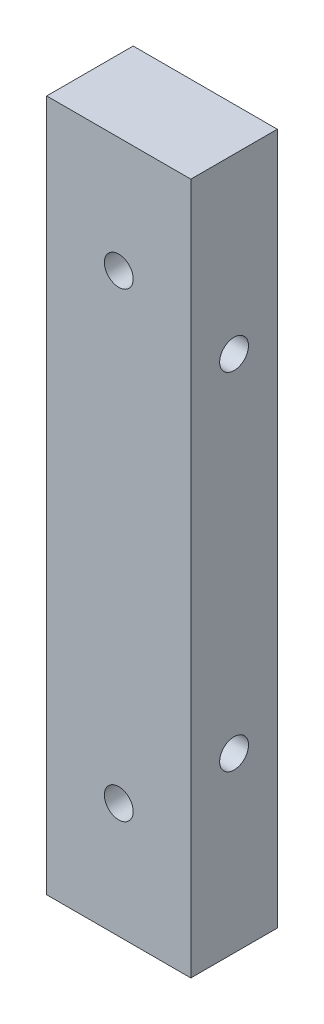
ISO-10303-21;
HEADER;
FILE_DESCRIPTION(('STEP AP214'),'2;1');
FILE_NAME('part.step','',(''),(''),'','','');
FILE_SCHEMA(('AUTOMOTIVE_DESIGN { 1 0 10303 214 1 1 1 1 }'));
ENDSEC;
DATA;
#1=APPLICATION_CONTEXT('core data for automotive mechanical design processes');
#2=APPLICATION_PROTOCOL_DEFINITION('international standard','automotive_design',2000,#1);
#3=PRODUCT_CONTEXT('',#1,'mechanical');
#4=PRODUCT('Part','Part','',(#3));
#5=PRODUCT_RELATED_PRODUCT_CATEGORY('part','',(#4));
#6=PRODUCT_DEFINITION_FORMATION('','',#4);
#7=PRODUCT_DEFINITION_CONTEXT('part definition',#1,'design');
#8=PRODUCT_DEFINITION('design','',#6,#7);
#9=PRODUCT_DEFINITION_SHAPE('','',#8);
#10=(LENGTH_UNIT() NAMED_UNIT(*) SI_UNIT(.MILLI.,.METRE.));
#11=(NAMED_UNIT(*) PLANE_ANGLE_UNIT() SI_UNIT($,.RADIAN.));
#12=(NAMED_UNIT(*) SI_UNIT($,.STERADIAN.) SOLID_ANGLE_UNIT());
#13=UNCERTAINTY_MEASURE_WITH_UNIT(LENGTH_MEASURE(1.E-05),#10,'distance_accuracy_value','');
#14=(GEOMETRIC_REPRESENTATION_CONTEXT(3) GLOBAL_UNCERTAINTY_ASSIGNED_CONTEXT((#13)) GLOBAL_UNIT_ASSIGNED_CONTEXT((#10,
#11,#12)) REPRESENTATION_CONTEXT('',''));
#15=CARTESIAN_POINT('',(0.,0.,0.));
#16=DIRECTION('',(0.,0.,1.));
#17=DIRECTION('',(1.,0.,0.));
#18=AXIS2_PLACEMENT_3D('',#15,#16,#17);
#19=CARTESIAN_POINT('',(12.5,60.,7.5));
#20=DIRECTION('',(-1.,0.,0.));
#21=DIRECTION('',(0.,0.,1.));
#22=AXIS2_PLACEMENT_3D('',#19,#20,#21);
#23=PLANE('',#22);
#24=CARTESIAN_POINT('',(12.5,30.,0.));
#25=DIRECTION('',(-1.,0.,0.));
#26=DIRECTION('',(0.,0.,1.));
#27=AXIS2_PLACEMENT_3D('',#24,#25,#26);
#28=CIRCLE('',#27,2.5);
#29=CARTESIAN_POINT('',(12.5,30.,2.49999999999998));
#30=VERTEX_POINT('',#29);
#31=EDGE_CURVE('E126',#30,#30,#28,.T.);
#32=ORIENTED_EDGE('',*,*,#31,.T.);
#33=EDGE_LOOP('',(#32));
#34=FACE_BOUND('',#33,.T.);
#35=CARTESIAN_POINT('',(12.5,-30.,0.));
#36=DIRECTION('',(-1.,0.,0.));
#37=DIRECTION('',(0.,0.,1.));
#38=AXIS2_PLACEMENT_3D('',#35,#36,#37);
#39=CIRCLE('',#38,2.5);
#40=CARTESIAN_POINT('',(12.5,-30.,2.5));
#41=VERTEX_POINT('',#40);
#42=EDGE_CURVE('E110',#41,#41,#39,.T.);
#43=ORIENTED_EDGE('',*,*,#42,.T.);
#44=EDGE_LOOP('',(#43));
#45=FACE_BOUND('',#44,.T.);
#46=DIRECTION('',(0.,0.,-1.));
#47=VECTOR('',#46,1.);
#48=CARTESIAN_POINT('',(12.5,-60.,7.5));
#49=LINE('',#48,#47);
#50=CARTESIAN_POINT('',(12.5,-60.,7.5));
#51=VERTEX_POINT('',#50);
#52=CARTESIAN_POINT('',(12.5,-60.,-7.5));
#53=VERTEX_POINT('',#52);
#54=EDGE_CURVE('E107',#51,#53,#49,.T.);
#55=ORIENTED_EDGE('',*,*,#54,.T.);
#56=DIRECTION('',(0.,-1.,0.));
#57=VECTOR('',#56,1.);
#58=CARTESIAN_POINT('',(12.5,60.,-7.5));
#59=LINE('',#58,#57);
#60=CARTESIAN_POINT('',(12.5,60.,-7.5));
#61=VERTEX_POINT('',#60);
#62=EDGE_CURVE('E11',#61,#53,#59,.T.);
#63=ORIENTED_EDGE('',*,*,#62,.F.);
#64=DIRECTION('',(0.,0.,-1.));
#65=VECTOR('',#64,1.);
#66=CARTESIAN_POINT('',(12.5,60.,7.5));
#67=LINE('',#66,#65);
#68=CARTESIAN_POINT('',(12.5,60.,7.5));
#69=VERTEX_POINT('',#68);
#70=EDGE_CURVE('E95',#69,#61,#67,.T.);
#71=ORIENTED_EDGE('',*,*,#70,.F.);
#72=DIRECTION('',(0.,-1.,0.));
#73=VECTOR('',#72,1.);
#74=CARTESIAN_POINT('',(12.5,60.,7.5));
#75=LINE('',#74,#73);
#76=EDGE_CURVE('E103',#69,#51,#75,.T.);
#77=ORIENTED_EDGE('',*,*,#76,.T.);
#78=EDGE_LOOP('',(#55,#63,#71,#77));
#79=FACE_BOUND('',#78,.T.);
#80=ADVANCED_FACE('F44',(#34,#45,#79),#23,.F.);
#81=CARTESIAN_POINT('',(-12.5,60.,-7.5));
#82=DIRECTION('',(0.,0.,1.));
#83=DIRECTION('',(1.,0.,0.));
#84=AXIS2_PLACEMENT_3D('',#81,#82,#83);
#85=PLANE('',#84);
#86=CARTESIAN_POINT('',(-7.49400541621981E-13,39.9999999999999,-7.5));
#87=DIRECTION('',(0.,0.,1.));
#88=DIRECTION('',(1.,0.,0.));
#89=AXIS2_PLACEMENT_3D('',#86,#87,#88);
#90=CIRCLE('',#89,2.5);
#91=CARTESIAN_POINT('',(2.49999999999925,39.9999999999999,-7.5));
#92=VERTEX_POINT('',#91);
#93=EDGE_CURVE('E138',#92,#92,#90,.T.);
#94=ORIENTED_EDGE('',*,*,#93,.T.);
#95=EDGE_LOOP('',(#94));
#96=FACE_BOUND('',#95,.T.);
#97=CARTESIAN_POINT('',(-7.7715611723761E-13,-40.0000000000001,-7.5));
#98=DIRECTION('',(0.,0.,1.));
#99=DIRECTION('',(1.,0.,0.));
#100=AXIS2_PLACEMENT_3D('',#97,#98,#99);
#101=CIRCLE('',#100,2.5);
#102=CARTESIAN_POINT('',(2.49999999999922,-40.0000000000001,-7.5));
#103=VERTEX_POINT('',#102);
#104=EDGE_CURVE('E132',#103,#103,#101,.T.);
#105=ORIENTED_EDGE('',*,*,#104,.T.);
#106=EDGE_LOOP('',(#105));
#107=FACE_BOUND('',#106,.T.);
#108=DIRECTION('',(-1.,0.,0.));
#109=VECTOR('',#108,1.);
#110=CARTESIAN_POINT('',(-12.5,-60.,-7.5));
#111=LINE('',#110,#109);
#112=CARTESIAN_POINT('',(-12.5,-60.,-7.5));
#113=VERTEX_POINT('',#112);
#114=EDGE_CURVE('E99',#53,#113,#111,.T.);
#115=ORIENTED_EDGE('',*,*,#114,.T.);
#116=DIRECTION('',(0.,-1.,0.));
#117=VECTOR('',#116,1.);
#118=CARTESIAN_POINT('',(-12.5,60.,-7.5));
#119=LINE('',#118,#117);
#120=CARTESIAN_POINT('',(-12.5,60.,-7.5));
#121=VERTEX_POINT('',#120);
#122=EDGE_CURVE('E52',#121,#113,#119,.T.);
#123=ORIENTED_EDGE('',*,*,#122,.F.);
#124=DIRECTION('',(-1.,0.,0.));
#125=VECTOR('',#124,1.);
#126=CARTESIAN_POINT('',(-12.5,60.,-7.5));
#127=LINE('',#126,#125);
#128=EDGE_CURVE('E90',#61,#121,#127,.T.);
#129=ORIENTED_EDGE('',*,*,#128,.F.);
#130=ORIENTED_EDGE('',*,*,#62,.T.);
#131=EDGE_LOOP('',(#115,#123,#129,#130));
#132=FACE_BOUND('',#131,.T.);
#133=ADVANCED_FACE('F98',(#96,#107,#132),#85,.F.);
#134=CARTESIAN_POINT('',(-12.5,60.,7.5));
#135=DIRECTION('',(1.,0.,0.));
#136=DIRECTION('',(0.,0.,-1.));
#137=AXIS2_PLACEMENT_3D('',#134,#135,#136);
#138=PLANE('',#137);
#139=CARTESIAN_POINT('',(-12.5,30.,0.));
#140=DIRECTION('',(-1.,0.,0.));
#141=DIRECTION('',(0.,0.,1.));
#142=AXIS2_PLACEMENT_3D('',#139,#140,#141);
#143=CIRCLE('',#142,2.49999999999999);
#144=CARTESIAN_POINT('',(-12.5,30.,2.49999999999998));
#145=VERTEX_POINT('',#144);
#146=EDGE_CURVE('E129',#145,#145,#143,.T.);
#147=ORIENTED_EDGE('',*,*,#146,.F.);
#148=EDGE_LOOP('',(#147));
#149=FACE_BOUND('',#148,.T.);
#150=CARTESIAN_POINT('',(-12.5,-30.,0.));
#151=DIRECTION('',(-1.,0.,0.));
#152=DIRECTION('',(0.,0.,1.));
#153=AXIS2_PLACEMENT_3D('',#150,#151,#152);
#154=CIRCLE('',#153,2.49999999999999);
#155=CARTESIAN_POINT('',(-12.5,-30.,2.49999999999999));
#156=VERTEX_POINT('',#155);
#157=EDGE_CURVE('E123',#156,#156,#154,.T.);
#158=ORIENTED_EDGE('',*,*,#157,.F.);
#159=EDGE_LOOP('',(#158));
#160=FACE_BOUND('',#159,.T.);
#161=DIRECTION('',(0.,0.,1.));
#162=VECTOR('',#161,1.);
#163=CARTESIAN_POINT('',(-12.5,-60.,7.5));
#164=LINE('',#163,#162);
#165=CARTESIAN_POINT('',(-12.5,-60.,7.5));
#166=VERTEX_POINT('',#165);
#167=EDGE_CURVE('E77',#113,#166,#164,.T.);
#168=ORIENTED_EDGE('',*,*,#167,.T.);
#169=DIRECTION('',(0.,-1.,0.));
#170=VECTOR('',#169,1.);
#171=CARTESIAN_POINT('',(-12.5,60.,7.5));
#172=LINE('',#171,#170);
#173=CARTESIAN_POINT('',(-12.5,60.,7.5));
#174=VERTEX_POINT('',#173);
#175=EDGE_CURVE('E100',#174,#166,#172,.T.);
#176=ORIENTED_EDGE('',*,*,#175,.F.);
#177=DIRECTION('',(0.,0.,1.));
#178=VECTOR('',#177,1.);
#179=CARTESIAN_POINT('',(-12.5,60.,7.5));
#180=LINE('',#179,#178);
#181=EDGE_CURVE('E93',#121,#174,#180,.T.);
#182=ORIENTED_EDGE('',*,*,#181,.F.);
#183=ORIENTED_EDGE('',*,*,#122,.T.);
#184=EDGE_LOOP('',(#168,#176,#182,#183));
#185=FACE_BOUND('',#184,.T.);
#186=ADVANCED_FACE('F101',(#149,#160,#185),#138,.F.);
#187=CARTESIAN_POINT('',(-12.5,60.,7.5));
#188=DIRECTION('',(0.,0.,-1.));
#189=DIRECTION('',(-1.,0.,0.));
#190=AXIS2_PLACEMENT_3D('',#187,#188,#189);
#191=PLANE('',#190);
#192=CARTESIAN_POINT('',(-7.49400541621981E-13,39.9999999999999,7.5));
#193=DIRECTION('',(0.,0.,1.));
#194=DIRECTION('',(1.,0.,0.));
#195=AXIS2_PLACEMENT_3D('',#192,#193,#194);
#196=CIRCLE('',#195,2.49999999999999);
#197=CARTESIAN_POINT('',(2.49999999999924,39.9999999999999,7.5));
#198=VERTEX_POINT('',#197);
#199=EDGE_CURVE('E141',#198,#198,#196,.T.);
#200=ORIENTED_EDGE('',*,*,#199,.F.);
#201=EDGE_LOOP('',(#200));
#202=FACE_BOUND('',#201,.T.);
#203=CARTESIAN_POINT('',(-7.7715611723761E-13,-40.0000000000001,7.5));
#204=DIRECTION('',(0.,0.,1.));
#205=DIRECTION('',(1.,0.,0.));
#206=AXIS2_PLACEMENT_3D('',#203,#204,#205);
#207=CIRCLE('',#206,2.49999999999999);
#208=CARTESIAN_POINT('',(2.49999999999921,-40.0000000000001,7.5));
#209=VERTEX_POINT('',#208);
#210=EDGE_CURVE('E135',#209,#209,#207,.T.);
#211=ORIENTED_EDGE('',*,*,#210,.F.);
#212=EDGE_LOOP('',(#211));
#213=FACE_BOUND('',#212,.T.);
#214=DIRECTION('',(1.,0.,0.));
#215=VECTOR('',#214,1.);
#216=CARTESIAN_POINT('',(-12.5,-60.,7.5));
#217=LINE('',#216,#215);
#218=EDGE_CURVE('E83',#166,#51,#217,.T.);
#219=ORIENTED_EDGE('',*,*,#218,.T.);
#220=ORIENTED_EDGE('',*,*,#76,.F.);
#221=DIRECTION('',(1.,0.,0.));
#222=VECTOR('',#221,1.);
#223=CARTESIAN_POINT('',(-12.5,60.,7.5));
#224=LINE('',#223,#222);
#225=EDGE_CURVE('E60',#174,#69,#224,.T.);
#226=ORIENTED_EDGE('',*,*,#225,.F.);
#227=ORIENTED_EDGE('',*,*,#175,.T.);
#228=EDGE_LOOP('',(#219,#220,#226,#227));
#229=FACE_BOUND('',#228,.T.);
#230=ADVANCED_FACE('F115',(#202,#213,#229),#191,.F.);
#231=CARTESIAN_POINT('',(0.,60.,0.));
#232=DIRECTION('',(0.,-1.,0.));
#233=DIRECTION('',(0.,0.,-1.));
#234=AXIS2_PLACEMENT_3D('',#231,#232,#233);
#235=PLANE('',#234);
#236=ORIENTED_EDGE('',*,*,#70,.T.);
#237=ORIENTED_EDGE('',*,*,#128,.T.);
#238=ORIENTED_EDGE('',*,*,#181,.T.);
#239=ORIENTED_EDGE('',*,*,#225,.T.);
#240=EDGE_LOOP('',(#236,#237,#238,#239));
#241=FACE_BOUND('',#240,.T.);
#242=ADVANCED_FACE('F91',(#241),#235,.F.);
#243=CARTESIAN_POINT('',(0.,-60.,0.));
#244=DIRECTION('',(0.,-1.,0.));
#245=DIRECTION('',(0.,0.,-1.));
#246=AXIS2_PLACEMENT_3D('',#243,#244,#245);
#247=PLANE('',#246);
#248=ORIENTED_EDGE('',*,*,#54,.F.);
#249=ORIENTED_EDGE('',*,*,#218,.F.);
#250=ORIENTED_EDGE('',*,*,#167,.F.);
#251=ORIENTED_EDGE('',*,*,#114,.F.);
#252=EDGE_LOOP('',(#248,#249,#250,#251));
#253=FACE_BOUND('',#252,.T.);
#254=ADVANCED_FACE('F118',(#253),#247,.T.);
#255=CARTESIAN_POINT('',(-12.5,-30.,0.));
#256=DIRECTION('',(-1.,0.,0.));
#257=DIRECTION('',(0.,0.,1.));
#258=AXIS2_PLACEMENT_3D('',#255,#256,#257);
#259=CYLINDRICAL_SURFACE('',#258,2.49999999999999);
#260=ORIENTED_EDGE('',*,*,#42,.F.);
#261=EDGE_LOOP('',(#260));
#262=FACE_BOUND('',#261,.T.);
#263=ORIENTED_EDGE('',*,*,#157,.T.);
#264=EDGE_LOOP('',(#263));
#265=FACE_BOUND('',#264,.T.);
#266=ADVANCED_FACE('F163',(#262,#265),#259,.F.);
#267=CARTESIAN_POINT('',(-12.5,30.,0.));
#268=DIRECTION('',(-1.,0.,0.));
#269=DIRECTION('',(0.,0.,1.));
#270=AXIS2_PLACEMENT_3D('',#267,#268,#269);
#271=CYLINDRICAL_SURFACE('',#270,2.49999999999999);
#272=ORIENTED_EDGE('',*,*,#31,.F.);
#273=EDGE_LOOP('',(#272));
#274=FACE_BOUND('',#273,.T.);
#275=ORIENTED_EDGE('',*,*,#146,.T.);
#276=EDGE_LOOP('',(#275));
#277=FACE_BOUND('',#276,.T.);
#278=ADVANCED_FACE('F154',(#274,#277),#271,.F.);
#279=CARTESIAN_POINT('',(-7.7715611723761E-13,-40.0000000000001,7.5));
#280=DIRECTION('',(0.,0.,1.));
#281=DIRECTION('',(1.,0.,0.));
#282=AXIS2_PLACEMENT_3D('',#279,#280,#281);
#283=CYLINDRICAL_SURFACE('',#282,2.49999999999999);
#284=ORIENTED_EDGE('',*,*,#104,.F.);
#285=EDGE_LOOP('',(#284));
#286=FACE_BOUND('',#285,.T.);
#287=ORIENTED_EDGE('',*,*,#210,.T.);
#288=EDGE_LOOP('',(#287));
#289=FACE_BOUND('',#288,.T.);
#290=ADVANCED_FACE('F152',(#286,#289),#283,.F.);
#291=CARTESIAN_POINT('',(-7.49400541621981E-13,39.9999999999999,7.5));
#292=DIRECTION('',(0.,0.,1.));
#293=DIRECTION('',(1.,0.,0.));
#294=AXIS2_PLACEMENT_3D('',#291,#292,#293);
#295=CYLINDRICAL_SURFACE('',#294,2.49999999999999);
#296=ORIENTED_EDGE('',*,*,#93,.F.);
#297=EDGE_LOOP('',(#296));
#298=FACE_BOUND('',#297,.T.);
#299=ORIENTED_EDGE('',*,*,#199,.T.);
#300=EDGE_LOOP('',(#299));
#301=FACE_BOUND('',#300,.T.);
#302=ADVANCED_FACE('F145',(#298,#301),#295,.F.);
#303=CLOSED_SHELL('',(#80,#133,#186,#230,#242,#254,#266,#278,#290,#302));
#304=MANIFOLD_SOLID_BREP('B2',#303);
#305=ADVANCED_BREP_SHAPE_REPRESENTATION('',(#18,#304),#14);
#306=SHAPE_DEFINITION_REPRESENTATION(#9,#305);
ENDSEC;
END-ISO-10303-21;
